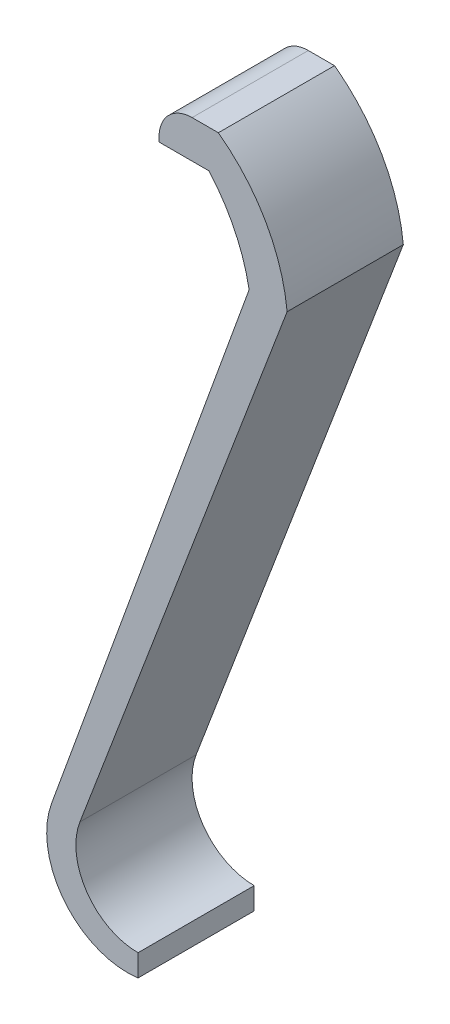
ISO-10303-21;
HEADER;
FILE_DESCRIPTION(('STEP AP214'),'2;1');
FILE_NAME('part.step','',(''),(''),'','','');
FILE_SCHEMA(('AUTOMOTIVE_DESIGN { 1 0 10303 214 1 1 1 1 }'));
ENDSEC;
DATA;
#1=APPLICATION_CONTEXT('core data for automotive mechanical design processes');
#2=APPLICATION_PROTOCOL_DEFINITION('international standard','automotive_design',2000,#1);
#3=PRODUCT_CONTEXT('',#1,'mechanical');
#4=PRODUCT('Part','Part','',(#3));
#5=PRODUCT_RELATED_PRODUCT_CATEGORY('part','',(#4));
#6=PRODUCT_DEFINITION_FORMATION('','',#4);
#7=PRODUCT_DEFINITION_CONTEXT('part definition',#1,'design');
#8=PRODUCT_DEFINITION('design','',#6,#7);
#9=PRODUCT_DEFINITION_SHAPE('','',#8);
#10=(LENGTH_UNIT() NAMED_UNIT(*) SI_UNIT(.MILLI.,.METRE.));
#11=(NAMED_UNIT(*) PLANE_ANGLE_UNIT() SI_UNIT($,.RADIAN.));
#12=(NAMED_UNIT(*) SI_UNIT($,.STERADIAN.) SOLID_ANGLE_UNIT());
#13=UNCERTAINTY_MEASURE_WITH_UNIT(LENGTH_MEASURE(1.E-05),#10,'distance_accuracy_value','');
#14=(GEOMETRIC_REPRESENTATION_CONTEXT(3) GLOBAL_UNCERTAINTY_ASSIGNED_CONTEXT((#13)) GLOBAL_UNIT_ASSIGNED_CONTEXT((#10,
#11,#12)) REPRESENTATION_CONTEXT('',''));
#15=CARTESIAN_POINT('',(0.,0.,0.));
#16=DIRECTION('',(0.,0.,1.));
#17=DIRECTION('',(1.,0.,0.));
#18=AXIS2_PLACEMENT_3D('',#15,#16,#17);
#19=CARTESIAN_POINT('',(-52.4291441659447,17.7632241415055,6.));
#20=DIRECTION('',(0.,0.,-1.));
#21=DIRECTION('',(-1.,0.,0.));
#22=AXIS2_PLACEMENT_3D('',#19,#20,#21);
#23=CYLINDRICAL_SURFACE('',#22,1.70710678118655);
#24=DIRECTION('',(0.,0.,1.));
#25=VECTOR('',#24,1.);
#26=CARTESIAN_POINT('',(-54.1362509471313,17.7632241415055,6.));
#27=LINE('',#26,#25);
#28=CARTESIAN_POINT('',(-54.1362509471313,17.7632241415055,6.));
#29=VERTEX_POINT('',#28);
#30=CARTESIAN_POINT('',(-54.1362509471313,17.7632241415055,0.));
#31=VERTEX_POINT('',#30);
#32=EDGE_CURVE('E151',#29,#31,#27,.F.);
#33=ORIENTED_EDGE('',*,*,#32,.F.);
#34=CARTESIAN_POINT('',(-52.4291441659447,17.7632241415055,6.));
#35=DIRECTION('',(0.,0.,1.));
#36=DIRECTION('',(1.,0.,0.));
#37=AXIS2_PLACEMENT_3D('',#34,#35,#36);
#38=CIRCLE('',#37,1.70710678118655);
#39=CARTESIAN_POINT('',(-52.4291441659447,19.470330922692,6.));
#40=VERTEX_POINT('',#39);
#41=EDGE_CURVE('E53',#40,#29,#38,.T.);
#42=ORIENTED_EDGE('',*,*,#41,.F.);
#43=DIRECTION('',(0.,0.,1.));
#44=VECTOR('',#43,1.);
#45=CARTESIAN_POINT('',(-52.4291441659447,19.470330922692,6.));
#46=LINE('',#45,#44);
#47=CARTESIAN_POINT('',(-52.4291441659447,19.470330922692,0.));
#48=VERTEX_POINT('',#47);
#49=EDGE_CURVE('E155',#48,#40,#46,.T.);
#50=ORIENTED_EDGE('',*,*,#49,.F.);
#51=CARTESIAN_POINT('',(-52.4291441659447,17.7632241415055,0.));
#52=DIRECTION('',(0.,0.,1.));
#53=DIRECTION('',(1.,0.,0.));
#54=AXIS2_PLACEMENT_3D('',#51,#52,#53);
#55=CIRCLE('',#54,1.70710678118655);
#56=EDGE_CURVE('E12',#31,#48,#55,.F.);
#57=ORIENTED_EDGE('',*,*,#56,.F.);
#58=EDGE_LOOP('',(#33,#42,#50,#57));
#59=FACE_BOUND('',#58,.T.);
#60=ADVANCED_FACE('F44',(#59),#23,.T.);
#61=CARTESIAN_POINT('',(-54.1362509471313,19.470330922692,6.));
#62=DIRECTION('',(1.,0.,0.));
#63=DIRECTION('',(0.,0.,-1.));
#64=AXIS2_PLACEMENT_3D('',#61,#62,#63);
#65=PLANE('',#64);
#66=DIRECTION('',(0.,-1.,0.));
#67=VECTOR('',#66,1.);
#68=CARTESIAN_POINT('',(-54.1362509471313,19.470330922692,6.));
#69=LINE('',#68,#67);
#70=CARTESIAN_POINT('',(-54.1362509471313,17.5221497975571,6.));
#71=VERTEX_POINT('',#70);
#72=EDGE_CURVE('E125',#29,#71,#69,.T.);
#73=ORIENTED_EDGE('',*,*,#72,.F.);
#74=ORIENTED_EDGE('',*,*,#32,.T.);
#75=DIRECTION('',(0.,-1.,0.));
#76=VECTOR('',#75,1.);
#77=CARTESIAN_POINT('',(-54.1362509471313,19.470330922692,0.));
#78=LINE('',#77,#76);
#79=CARTESIAN_POINT('',(-54.1362509471313,17.5221497975571,0.));
#80=VERTEX_POINT('',#79);
#81=EDGE_CURVE('E148',#31,#80,#78,.T.);
#82=ORIENTED_EDGE('',*,*,#81,.T.);
#83=DIRECTION('',(0.,0.,-1.));
#84=VECTOR('',#83,1.);
#85=CARTESIAN_POINT('',(-54.1362509471313,17.5221497975571,6.));
#86=LINE('',#85,#84);
#87=EDGE_CURVE('E140',#71,#80,#86,.T.);
#88=ORIENTED_EDGE('',*,*,#87,.F.);
#89=EDGE_LOOP('',(#73,#74,#82,#88));
#90=FACE_BOUND('',#89,.T.);
#91=ADVANCED_FACE('F147',(#90),#65,.F.);
#92=CARTESIAN_POINT('',(-54.1362509471313,17.5221497975571,6.));
#93=DIRECTION('',(0.,1.,0.));
#94=DIRECTION('',(0.,0.,1.));
#95=AXIS2_PLACEMENT_3D('',#92,#93,#94);
#96=PLANE('',#95);
#97=DIRECTION('',(1.,0.,0.));
#98=VECTOR('',#97,1.);
#99=CARTESIAN_POINT('',(-54.1362509471313,17.5221497975571,0.));
#100=LINE('',#99,#98);
#101=CARTESIAN_POINT('',(-51.5594236846797,17.5221497975571,0.));
#102=VERTEX_POINT('',#101);
#103=EDGE_CURVE('E185',#80,#102,#100,.T.);
#104=ORIENTED_EDGE('',*,*,#103,.T.);
#105=DIRECTION('',(0.,0.,-1.));
#106=VECTOR('',#105,1.);
#107=CARTESIAN_POINT('',(-51.5594236846797,17.5221497975571,6.));
#108=LINE('',#107,#106);
#109=CARTESIAN_POINT('',(-51.5594236846797,17.5221497975571,6.));
#110=VERTEX_POINT('',#109);
#111=EDGE_CURVE('E142',#110,#102,#108,.T.);
#112=ORIENTED_EDGE('',*,*,#111,.F.);
#113=DIRECTION('',(1.,0.,0.));
#114=VECTOR('',#113,1.);
#115=CARTESIAN_POINT('',(-54.1362509471313,17.5221497975571,6.));
#116=LINE('',#115,#114);
#117=EDGE_CURVE('E129',#71,#110,#116,.T.);
#118=ORIENTED_EDGE('',*,*,#117,.F.);
#119=ORIENTED_EDGE('',*,*,#87,.T.);
#120=EDGE_LOOP('',(#104,#112,#118,#119));
#121=FACE_BOUND('',#120,.T.);
#122=ADVANCED_FACE('F139',(#121),#96,.F.);
#123=CARTESIAN_POINT('',(-58.1776425358559,11.6716310947949,6.));
#124=DIRECTION('',(0.,0.,-1.));
#125=DIRECTION('',(-1.,0.,0.));
#126=AXIS2_PLACEMENT_3D('',#123,#124,#125);
#127=CYLINDRICAL_SURFACE('',#126,8.83342458242749);
#128=CARTESIAN_POINT('',(-58.1776425358559,11.6716310947949,0.));
#129=DIRECTION('',(0.,0.,-1.));
#130=DIRECTION('',(1.,0.,0.));
#131=AXIS2_PLACEMENT_3D('',#128,#129,#130);
#132=CIRCLE('',#131,8.83342458242749);
#133=CARTESIAN_POINT('',(-49.4847421970224,13.2409855966655,0.));
#134=VERTEX_POINT('',#133);
#135=EDGE_CURVE('E188',#102,#134,#132,.T.);
#136=ORIENTED_EDGE('',*,*,#135,.T.);
#137=DIRECTION('',(0.,0.,-1.));
#138=VECTOR('',#137,1.);
#139=CARTESIAN_POINT('',(-49.4847421970224,13.2409855966655,6.));
#140=LINE('',#139,#138);
#141=CARTESIAN_POINT('',(-49.4847421970224,13.2409855966655,6.));
#142=VERTEX_POINT('',#141);
#143=EDGE_CURVE('E157',#142,#134,#140,.T.);
#144=ORIENTED_EDGE('',*,*,#143,.F.);
#145=CARTESIAN_POINT('',(-58.1776425358559,11.6716310947949,6.));
#146=DIRECTION('',(0.,0.,-1.));
#147=DIRECTION('',(1.,0.,0.));
#148=AXIS2_PLACEMENT_3D('',#145,#146,#147);
#149=CIRCLE('',#148,8.83342458242749);
#150=EDGE_CURVE('E145',#110,#142,#149,.T.);
#151=ORIENTED_EDGE('',*,*,#150,.F.);
#152=ORIENTED_EDGE('',*,*,#111,.T.);
#153=EDGE_LOOP('',(#136,#144,#151,#152));
#154=FACE_BOUND('',#153,.T.);
#155=ADVANCED_FACE('F287',(#154),#127,.F.);
#156=CARTESIAN_POINT('',(-49.4847421970224,13.2409855966655,6.));
#157=DIRECTION('',(0.939860389138554,-0.341558851339452,0.));
#158=DIRECTION('',(0.341558851339452,0.939860389138554,0.));
#159=AXIS2_PLACEMENT_3D('',#156,#157,#158);
#160=PLANE('',#159);
#161=DIRECTION('',(-0.341558851339452,-0.939860389138554,0.));
#162=VECTOR('',#161,1.);
#163=CARTESIAN_POINT('',(-49.4847421970224,13.2409855966655,0.));
#164=LINE('',#163,#162);
#165=CARTESIAN_POINT('',(-59.6875240764217,-14.833797152671,0.));
#166=VERTEX_POINT('',#165);
#167=EDGE_CURVE('E191',#134,#166,#164,.T.);
#168=ORIENTED_EDGE('',*,*,#167,.T.);
#169=DIRECTION('',(0.,0.,-1.));
#170=VECTOR('',#169,1.);
#171=CARTESIAN_POINT('',(-59.6875240764217,-14.833797152671,6.));
#172=LINE('',#171,#170);
#173=CARTESIAN_POINT('',(-59.6875240764217,-14.833797152671,6.));
#174=VERTEX_POINT('',#173);
#175=EDGE_CURVE('E226',#174,#166,#172,.T.);
#176=ORIENTED_EDGE('',*,*,#175,.F.);
#177=DIRECTION('',(-0.341558851339452,-0.939860389138554,0.));
#178=VECTOR('',#177,1.);
#179=CARTESIAN_POINT('',(-49.4847421970224,13.2409855966655,6.));
#180=LINE('',#179,#178);
#181=EDGE_CURVE('E237',#142,#174,#180,.T.);
#182=ORIENTED_EDGE('',*,*,#181,.F.);
#183=ORIENTED_EDGE('',*,*,#143,.T.);
#184=EDGE_LOOP('',(#168,#176,#182,#183));
#185=FACE_BOUND('',#184,.T.);
#186=ADVANCED_FACE('F235',(#185),#160,.F.);
#187=CARTESIAN_POINT('',(-55.7578952578434,-16.2618810691495,6.));
#188=DIRECTION('',(0.,0.,-1.));
#189=DIRECTION('',(-1.,0.,0.));
#190=AXIS2_PLACEMENT_3D('',#187,#188,#189);
#191=CYLINDRICAL_SURFACE('',#190,4.18107717272777);
#192=CARTESIAN_POINT('',(-55.7578952578434,-16.2618810691495,0.));
#193=DIRECTION('',(0.,0.,1.));
#194=DIRECTION('',(1.,0.,0.));
#195=AXIS2_PLACEMENT_3D('',#192,#193,#194);
#196=CIRCLE('',#195,4.18107717272777);
#197=CARTESIAN_POINT('',(-55.2223352364541,-20.4085160648773,0.));
#198=VERTEX_POINT('',#197);
#199=EDGE_CURVE('E194',#166,#198,#196,.T.);
#200=ORIENTED_EDGE('',*,*,#199,.T.);
#201=DIRECTION('',(0.,0.,-1.));
#202=VECTOR('',#201,1.);
#203=CARTESIAN_POINT('',(-55.2223352364541,-20.4085160648773,6.));
#204=LINE('',#203,#202);
#205=CARTESIAN_POINT('',(-55.2223352364541,-20.4085160648773,6.));
#206=VERTEX_POINT('',#205);
#207=EDGE_CURVE('E222',#206,#198,#204,.T.);
#208=ORIENTED_EDGE('',*,*,#207,.F.);
#209=CARTESIAN_POINT('',(-55.7578952578434,-16.2618810691495,6.));
#210=DIRECTION('',(0.,0.,1.));
#211=DIRECTION('',(1.,0.,0.));
#212=AXIS2_PLACEMENT_3D('',#209,#210,#211);
#213=CIRCLE('',#212,4.18107717272777);
#214=EDGE_CURVE('E256',#174,#206,#213,.T.);
#215=ORIENTED_EDGE('',*,*,#214,.F.);
#216=ORIENTED_EDGE('',*,*,#175,.T.);
#217=EDGE_LOOP('',(#200,#208,#215,#216));
#218=FACE_BOUND('',#217,.T.);
#219=ADVANCED_FACE('F246',(#218),#191,.T.);
#220=CARTESIAN_POINT('',(-55.2223352364541,-20.4085160648773,6.));
#221=DIRECTION('',(-1.,0.,0.));
#222=DIRECTION('',(0.,0.,1.));
#223=AXIS2_PLACEMENT_3D('',#220,#221,#222);
#224=PLANE('',#223);
#225=DIRECTION('',(0.,1.,0.));
#226=VECTOR('',#225,1.);
#227=CARTESIAN_POINT('',(-55.2223352364541,-20.4085160648773,0.));
#228=LINE('',#227,#226);
#229=CARTESIAN_POINT('',(-55.2223352364541,-19.2775514476593,0.));
#230=VERTEX_POINT('',#229);
#231=EDGE_CURVE('E197',#198,#230,#228,.T.);
#232=ORIENTED_EDGE('',*,*,#231,.T.);
#233=DIRECTION('',(0.,0.,-1.));
#234=VECTOR('',#233,1.);
#235=CARTESIAN_POINT('',(-55.2223352364541,-19.2775514476593,6.));
#236=LINE('',#235,#234);
#237=CARTESIAN_POINT('',(-55.2223352364541,-19.2775514476593,6.));
#238=VERTEX_POINT('',#237);
#239=EDGE_CURVE('E218',#238,#230,#236,.T.);
#240=ORIENTED_EDGE('',*,*,#239,.F.);
#241=DIRECTION('',(0.,1.,0.));
#242=VECTOR('',#241,1.);
#243=CARTESIAN_POINT('',(-55.2223352364541,-20.4085160648773,6.));
#244=LINE('',#243,#242);
#245=EDGE_CURVE('E252',#206,#238,#244,.T.);
#246=ORIENTED_EDGE('',*,*,#245,.F.);
#247=ORIENTED_EDGE('',*,*,#207,.T.);
#248=EDGE_LOOP('',(#232,#240,#246,#247));
#249=FACE_BOUND('',#248,.T.);
#250=ADVANCED_FACE('F250',(#249),#224,.F.);
#251=CARTESIAN_POINT('',(-55.2223352364544,-16.0675343848719,6.));
#252=DIRECTION('',(0.,0.,-1.));
#253=DIRECTION('',(-1.,0.,0.));
#254=AXIS2_PLACEMENT_3D('',#251,#252,#253);
#255=CYLINDRICAL_SURFACE('',#254,3.21001706278732);
#256=CARTESIAN_POINT('',(-55.2223352364544,-16.0675343848719,0.));
#257=DIRECTION('',(0.,0.,-1.));
#258=DIRECTION('',(1.,0.,0.));
#259=AXIS2_PLACEMENT_3D('',#256,#257,#258);
#260=CIRCLE('',#259,3.21001706278732);
#261=CARTESIAN_POINT('',(-58.2231177971432,-14.9275722947778,0.));
#262=VERTEX_POINT('',#261);
#263=EDGE_CURVE('E200',#230,#262,#260,.T.);
#264=ORIENTED_EDGE('',*,*,#263,.T.);
#265=DIRECTION('',(0.,0.,-1.));
#266=VECTOR('',#265,1.);
#267=CARTESIAN_POINT('',(-58.2231177971432,-14.9275722947778,6.));
#268=LINE('',#267,#266);
#269=CARTESIAN_POINT('',(-58.2231177971432,-14.9275722947778,6.));
#270=VERTEX_POINT('',#269);
#271=EDGE_CURVE('E214',#270,#262,#268,.T.);
#272=ORIENTED_EDGE('',*,*,#271,.F.);
#273=CARTESIAN_POINT('',(-55.2223352364544,-16.0675343848719,6.));
#274=DIRECTION('',(0.,0.,-1.));
#275=DIRECTION('',(1.,0.,0.));
#276=AXIS2_PLACEMENT_3D('',#273,#274,#275);
#277=CIRCLE('',#276,3.21001706278732);
#278=EDGE_CURVE('E255',#238,#270,#277,.T.);
#279=ORIENTED_EDGE('',*,*,#278,.F.);
#280=ORIENTED_EDGE('',*,*,#239,.T.);
#281=EDGE_LOOP('',(#264,#272,#279,#280));
#282=FACE_BOUND('',#281,.T.);
#283=ADVANCED_FACE('F274',(#282),#255,.F.);
#284=CARTESIAN_POINT('',(-47.5222131232982,13.2409855966655,6.));
#285=DIRECTION('',(-0.93481825859304,0.355126489297935,0.));
#286=DIRECTION('',(-0.355126489297935,-0.93481825859304,0.));
#287=AXIS2_PLACEMENT_3D('',#284,#285,#286);
#288=PLANE('',#287);
#289=DIRECTION('',(0.355126489297935,0.93481825859304,0.));
#290=VECTOR('',#289,1.);
#291=CARTESIAN_POINT('',(-47.5222131232982,13.2409855966655,0.));
#292=LINE('',#291,#290);
#293=CARTESIAN_POINT('',(-47.5222131232982,13.2409855966655,0.));
#294=VERTEX_POINT('',#293);
#295=EDGE_CURVE('E203',#262,#294,#292,.T.);
#296=ORIENTED_EDGE('',*,*,#295,.T.);
#297=DIRECTION('',(0.,0.,-1.));
#298=VECTOR('',#297,1.);
#299=CARTESIAN_POINT('',(-47.5222131232982,13.2409855966655,6.));
#300=LINE('',#299,#298);
#301=CARTESIAN_POINT('',(-47.5222131232982,13.2409855966655,6.));
#302=VERTEX_POINT('',#301);
#303=EDGE_CURVE('E177',#302,#294,#300,.T.);
#304=ORIENTED_EDGE('',*,*,#303,.F.);
#305=DIRECTION('',(0.355126489297935,0.93481825859304,0.));
#306=VECTOR('',#305,1.);
#307=CARTESIAN_POINT('',(-47.5222131232982,13.2409855966655,6.));
#308=LINE('',#307,#306);
#309=EDGE_CURVE('E179',#270,#302,#308,.T.);
#310=ORIENTED_EDGE('',*,*,#309,.F.);
#311=ORIENTED_EDGE('',*,*,#271,.T.);
#312=EDGE_LOOP('',(#296,#304,#310,#311));
#313=FACE_BOUND('',#312,.T.);
#314=ADVANCED_FACE('F268',(#313),#288,.F.);
#315=CARTESIAN_POINT('',(-56.3113649133694,12.3576959134229,6.));
#316=DIRECTION('',(0.,0.,-1.));
#317=DIRECTION('',(-1.,0.,0.));
#318=AXIS2_PLACEMENT_3D('',#315,#316,#317);
#319=CYLINDRICAL_SURFACE('',#318,8.8334245824275);
#320=CARTESIAN_POINT('',(-56.3113649133694,12.3576959134229,0.));
#321=DIRECTION('',(0.,0.,1.));
#322=DIRECTION('',(1.,0.,0.));
#323=AXIS2_PLACEMENT_3D('',#320,#321,#322);
#324=CIRCLE('',#323,8.8334245824275);
#325=CARTESIAN_POINT('',(-51.0730624136704,19.470330922692,0.));
#326=VERTEX_POINT('',#325);
#327=EDGE_CURVE('E206',#294,#326,#324,.T.);
#328=ORIENTED_EDGE('',*,*,#327,.T.);
#329=DIRECTION('',(0.,0.,-1.));
#330=VECTOR('',#329,1.);
#331=CARTESIAN_POINT('',(-51.0730624136704,19.470330922692,6.));
#332=LINE('',#331,#330);
#333=CARTESIAN_POINT('',(-51.0730624136704,19.470330922692,6.));
#334=VERTEX_POINT('',#333);
#335=EDGE_CURVE('E173',#334,#326,#332,.T.);
#336=ORIENTED_EDGE('',*,*,#335,.F.);
#337=CARTESIAN_POINT('',(-56.3113649133694,12.3576959134229,6.));
#338=DIRECTION('',(0.,0.,1.));
#339=DIRECTION('',(1.,0.,0.));
#340=AXIS2_PLACEMENT_3D('',#337,#338,#339);
#341=CIRCLE('',#340,8.8334245824275);
#342=EDGE_CURVE('E170',#302,#334,#341,.T.);
#343=ORIENTED_EDGE('',*,*,#342,.F.);
#344=ORIENTED_EDGE('',*,*,#303,.T.);
#345=EDGE_LOOP('',(#328,#336,#343,#344));
#346=FACE_BOUND('',#345,.T.);
#347=ADVANCED_FACE('F272',(#346),#319,.T.);
#348=CARTESIAN_POINT('',(-54.1362509471313,19.470330922692,6.));
#349=DIRECTION('',(0.,-1.,0.));
#350=DIRECTION('',(0.,0.,-1.));
#351=AXIS2_PLACEMENT_3D('',#348,#349,#350);
#352=PLANE('',#351);
#353=DIRECTION('',(-1.,0.,0.));
#354=VECTOR('',#353,1.);
#355=CARTESIAN_POINT('',(-54.1362509471313,19.470330922692,0.));
#356=LINE('',#355,#354);
#357=EDGE_CURVE('E135',#326,#48,#356,.T.);
#358=ORIENTED_EDGE('',*,*,#357,.T.);
#359=ORIENTED_EDGE('',*,*,#49,.T.);
#360=DIRECTION('',(-1.,0.,0.));
#361=VECTOR('',#360,1.);
#362=CARTESIAN_POINT('',(-54.1362509471313,19.470330922692,6.));
#363=LINE('',#362,#361);
#364=EDGE_CURVE('E168',#334,#40,#363,.T.);
#365=ORIENTED_EDGE('',*,*,#364,.F.);
#366=ORIENTED_EDGE('',*,*,#335,.T.);
#367=EDGE_LOOP('',(#358,#359,#365,#366));
#368=FACE_BOUND('',#367,.T.);
#369=ADVANCED_FACE('F166',(#368),#352,.F.);
#370=CARTESIAN_POINT('',(-58.1776425358559,11.6716310947949,6.));
#371=DIRECTION('',(0.,0.,1.));
#372=DIRECTION('',(1.,0.,0.));
#373=AXIS2_PLACEMENT_3D('',#370,#371,#372);
#374=PLANE('',#373);
#375=ORIENTED_EDGE('',*,*,#364,.T.);
#376=ORIENTED_EDGE('',*,*,#41,.T.);
#377=ORIENTED_EDGE('',*,*,#72,.T.);
#378=ORIENTED_EDGE('',*,*,#117,.T.);
#379=ORIENTED_EDGE('',*,*,#150,.T.);
#380=ORIENTED_EDGE('',*,*,#181,.T.);
#381=ORIENTED_EDGE('',*,*,#214,.T.);
#382=ORIENTED_EDGE('',*,*,#245,.T.);
#383=ORIENTED_EDGE('',*,*,#278,.T.);
#384=ORIENTED_EDGE('',*,*,#309,.T.);
#385=ORIENTED_EDGE('',*,*,#342,.T.);
#386=EDGE_LOOP('',(#375,#376,#377,#378,#379,#380,#381,#382,#383,#384,#385));
#387=FACE_BOUND('',#386,.T.);
#388=ADVANCED_FACE('F128',(#387),#374,.T.);
#389=CARTESIAN_POINT('',(-58.1776425358559,11.6716310947949,0.));
#390=DIRECTION('',(0.,0.,1.));
#391=DIRECTION('',(1.,0.,0.));
#392=AXIS2_PLACEMENT_3D('',#389,#390,#391);
#393=PLANE('',#392);
#394=ORIENTED_EDGE('',*,*,#81,.F.);
#395=ORIENTED_EDGE('',*,*,#56,.T.);
#396=ORIENTED_EDGE('',*,*,#357,.F.);
#397=ORIENTED_EDGE('',*,*,#327,.F.);
#398=ORIENTED_EDGE('',*,*,#295,.F.);
#399=ORIENTED_EDGE('',*,*,#263,.F.);
#400=ORIENTED_EDGE('',*,*,#231,.F.);
#401=ORIENTED_EDGE('',*,*,#199,.F.);
#402=ORIENTED_EDGE('',*,*,#167,.F.);
#403=ORIENTED_EDGE('',*,*,#135,.F.);
#404=ORIENTED_EDGE('',*,*,#103,.F.);
#405=EDGE_LOOP('',(#394,#395,#396,#397,#398,#399,#400,#401,#402,#403,#404));
#406=FACE_BOUND('',#405,.T.);
#407=ADVANCED_FACE('F241',(#406),#393,.F.);
#408=CLOSED_SHELL('',(#60,#91,#122,#155,#186,#219,#250,#283,#314,#347,#369,#388,#407));
#409=MANIFOLD_SOLID_BREP('B2',#408);
#410=ADVANCED_BREP_SHAPE_REPRESENTATION('',(#18,#409),#14);
#411=SHAPE_DEFINITION_REPRESENTATION(#9,#410);
ENDSEC;
END-ISO-10303-21;
